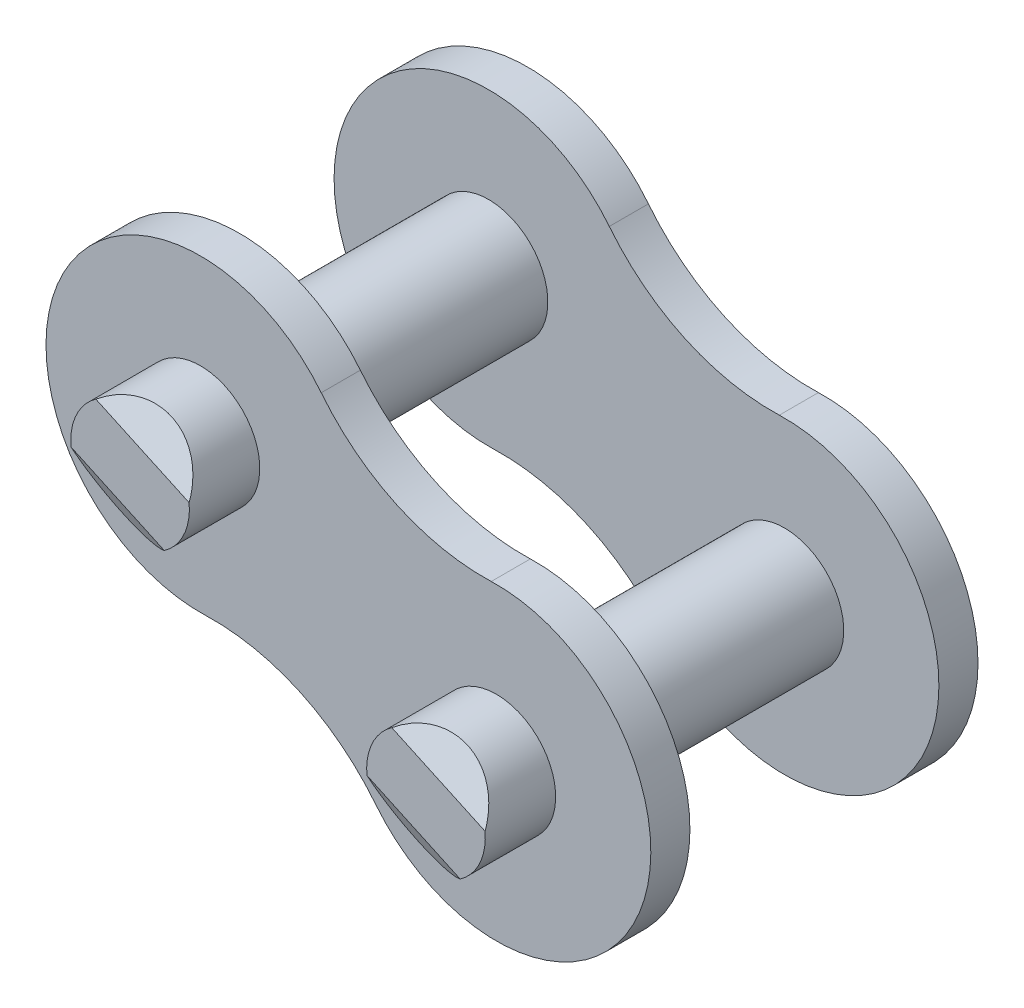
ISO-10303-21;
HEADER;
FILE_DESCRIPTION(('STEP AP214'),'2;1');
FILE_NAME('part.step','',(''),(''),'','','');
FILE_SCHEMA(('AUTOMOTIVE_DESIGN { 1 0 10303 214 1 1 1 1 }'));
ENDSEC;
DATA;
#1=APPLICATION_CONTEXT('core data for automotive mechanical design processes');
#2=APPLICATION_PROTOCOL_DEFINITION('international standard','automotive_design',2000,#1);
#3=PRODUCT_CONTEXT('',#1,'mechanical');
#4=PRODUCT('Part','Part','',(#3));
#5=PRODUCT_RELATED_PRODUCT_CATEGORY('part','',(#4));
#6=PRODUCT_DEFINITION_FORMATION('','',#4);
#7=PRODUCT_DEFINITION_CONTEXT('part definition',#1,'design');
#8=PRODUCT_DEFINITION('design','',#6,#7);
#9=PRODUCT_DEFINITION_SHAPE('','',#8);
#10=(LENGTH_UNIT() NAMED_UNIT(*) SI_UNIT(.MILLI.,.METRE.));
#11=(NAMED_UNIT(*) PLANE_ANGLE_UNIT() SI_UNIT($,.RADIAN.));
#12=(NAMED_UNIT(*) SI_UNIT($,.STERADIAN.) SOLID_ANGLE_UNIT());
#13=UNCERTAINTY_MEASURE_WITH_UNIT(LENGTH_MEASURE(1.E-05),#10,'distance_accuracy_value','');
#14=(GEOMETRIC_REPRESENTATION_CONTEXT(3) GLOBAL_UNCERTAINTY_ASSIGNED_CONTEXT((#13)) GLOBAL_UNIT_ASSIGNED_CONTEXT((#10,
#11,#12)) REPRESENTATION_CONTEXT('',''));
#15=CARTESIAN_POINT('',(0.,0.,0.));
#16=DIRECTION('',(0.,0.,1.));
#17=DIRECTION('',(1.,0.,0.));
#18=AXIS2_PLACEMENT_3D('',#15,#16,#17);
#19=CARTESIAN_POINT('',(102.7187869314,932.554559804421,-131.392489073474));
#20=DIRECTION('',(-0.209479230616201,-0.454002700366908,0.866025403784439));
#21=DIRECTION('',(-0.908005400733816,0.418958461232402,0.));
#22=AXIS2_PLACEMENT_3D('',#19,#20,#21);
#23=PLANE('',#22);
#24=CARTESIAN_POINT('',(115.524136772828,925.691511787227,-131.892921853051));
#25=DIRECTION('',(0.209479230616201,0.454002700366908,-0.866025403784439));
#26=DIRECTION('',(0.362828670557698,0.786355743808955,0.5));
#27=AXIS2_PLACEMENT_3D('',#24,#25,#26);
#28=ELLIPSE('',#27,1.3344874122049,1.1557);
#29=CARTESIAN_POINT('',(114.857440586531,926.635523802605,-131.5593));
#30=VERTEX_POINT('',#29);
#31=CARTESIAN_POINT('',(116.675023252771,925.796881613478,-131.5593));
#32=VERTEX_POINT('',#31);
#33=EDGE_CURVE('E260',#30,#32,#28,.T.);
#34=ORIENTED_EDGE('',*,*,#33,.T.);
#35=DIRECTION('',(0.908005400733817,-0.418958461232401,0.));
#36=VECTOR('',#35,1.);
#37=CARTESIAN_POINT('',(102.597739357989,932.292214344014,-131.5593));
#38=LINE('',#37,#36);
#39=EDGE_CURVE('E353',#30,#32,#38,.T.);
#40=ORIENTED_EDGE('',*,*,#39,.F.);
#41=EDGE_LOOP('',(#34,#40));
#42=FACE_BOUND('',#41,.T.);
#43=ADVANCED_FACE('F17',(#42),#23,.F.);
#44=CARTESIAN_POINT('',(101.992501490931,930.980487041978,-131.392489073474));
#45=DIRECTION('',(-0.209479230616201,-0.454002700366909,-0.866025403784438));
#46=DIRECTION('',(0.,-0.885675807339342,0.464304172169284));
#47=AXIS2_PLACEMENT_3D('',#44,#45,#46);
#48=PLANE('',#47);
#49=CARTESIAN_POINT('',(115.524136772828,925.691511787227,-131.892921853051));
#50=DIRECTION('',(0.209479230616201,0.454002700366908,0.866025403784439));
#51=DIRECTION('',(-0.362828670557697,-0.786355743808954,0.5));
#52=AXIS2_PLACEMENT_3D('',#49,#50,#51);
#53=ELLIPSE('',#52,1.3344874122049,1.1557);
#54=CARTESIAN_POINT('',(114.373250292884,925.586141960977,-131.5593));
#55=VERTEX_POINT('',#54);
#56=CARTESIAN_POINT('',(116.190832959124,924.74749977185,-131.5593));
#57=VERTEX_POINT('',#56);
#58=EDGE_CURVE('E259',#55,#57,#53,.T.);
#59=ORIENTED_EDGE('',*,*,#58,.F.);
#60=DIRECTION('',(0.908005400733817,-0.418958461232401,0.));
#61=VECTOR('',#60,1.);
#62=CARTESIAN_POINT('',(102.113549064342,931.242832502385,-131.5593));
#63=LINE('',#62,#61);
#64=EDGE_CURVE('E356',#55,#57,#63,.T.);
#65=ORIENTED_EDGE('',*,*,#64,.T.);
#66=EDGE_LOOP('',(#59,#65));
#67=FACE_BOUND('',#66,.T.);
#68=ADVANCED_FACE('F431',(#67),#48,.T.);
#69=CARTESIAN_POINT('',(102.7187869314,932.554559804421,-131.392489073474));
#70=DIRECTION('',(-0.209479230616201,-0.454002700366908,0.866025403784439));
#71=DIRECTION('',(-0.908005400733816,0.418958461232402,0.));
#72=AXIS2_PLACEMENT_3D('',#69,#70,#71);
#73=PLANE('',#72);
#74=CARTESIAN_POINT('',(121.289971067487,923.031125558402,-131.892921853051));
#75=DIRECTION('',(0.209479230616201,0.454002700366908,-0.866025403784439));
#76=DIRECTION('',(0.362828670557698,0.786355743808955,0.5));
#77=AXIS2_PLACEMENT_3D('',#74,#75,#76);
#78=ELLIPSE('',#77,1.3344874122049,1.1557);
#79=CARTESIAN_POINT('',(120.62327488119,923.975137573779,-131.5593));
#80=VERTEX_POINT('',#79);
#81=CARTESIAN_POINT('',(122.44085754743,923.136495384652,-131.5593));
#82=VERTEX_POINT('',#81);
#83=EDGE_CURVE('E364',#80,#82,#78,.T.);
#84=ORIENTED_EDGE('',*,*,#83,.T.);
#85=DIRECTION('',(0.908005400733817,-0.418958461232401,0.));
#86=VECTOR('',#85,1.);
#87=CARTESIAN_POINT('',(102.597739357989,932.292214344014,-131.5593));
#88=LINE('',#87,#86);
#89=EDGE_CURVE('E236',#80,#82,#88,.T.);
#90=ORIENTED_EDGE('',*,*,#89,.F.);
#91=EDGE_LOOP('',(#84,#90));
#92=FACE_BOUND('',#91,.T.);
#93=ADVANCED_FACE('F425',(#92),#73,.F.);
#94=CARTESIAN_POINT('',(101.992501490931,930.980487041978,-131.392489073474));
#95=DIRECTION('',(-0.209479230616201,-0.454002700366909,-0.866025403784438));
#96=DIRECTION('',(0.,-0.885675807339342,0.464304172169284));
#97=AXIS2_PLACEMENT_3D('',#94,#95,#96);
#98=PLANE('',#97);
#99=CARTESIAN_POINT('',(121.289971067487,923.031125558402,-131.892921853051));
#100=DIRECTION('',(0.209479230616201,0.454002700366908,0.866025403784439));
#101=DIRECTION('',(-0.362828670557697,-0.786355743808954,0.5));
#102=AXIS2_PLACEMENT_3D('',#99,#100,#101);
#103=ELLIPSE('',#102,1.3344874122049,1.1557);
#104=CARTESIAN_POINT('',(120.139084587544,922.925755732151,-131.5593));
#105=VERTEX_POINT('',#104);
#106=CARTESIAN_POINT('',(121.956667253784,922.087113543024,-131.5593));
#107=VERTEX_POINT('',#106);
#108=EDGE_CURVE('E237',#105,#107,#103,.T.);
#109=ORIENTED_EDGE('',*,*,#108,.F.);
#110=DIRECTION('',(0.908005400733817,-0.418958461232401,0.));
#111=VECTOR('',#110,1.);
#112=CARTESIAN_POINT('',(102.113549064342,931.242832502385,-131.5593));
#113=LINE('',#112,#111);
#114=EDGE_CURVE('E297',#105,#107,#113,.T.);
#115=ORIENTED_EDGE('',*,*,#114,.T.);
#116=EDGE_LOOP('',(#109,#115));
#117=FACE_BOUND('',#116,.T.);
#118=ADVANCED_FACE('F430',(#117),#98,.T.);
#119=CARTESIAN_POINT('',(118.407053920157,924.361318672814,-129.4257));
#120=DIRECTION('',(0.,0.,-1.));
#121=DIRECTION('',(0.,-1.,0.));
#122=AXIS2_PLACEMENT_3D('',#119,#120,#121);
#123=PLANE('',#122);
#124=CARTESIAN_POINT('',(115.524136772828,925.691511787227,-129.4257));
#125=DIRECTION('',(0.,0.,1.));
#126=DIRECTION('',(0.908005400733817,-0.418958461232401,0.));
#127=AXIS2_PLACEMENT_3D('',#124,#125,#126);
#128=CIRCLE('',#127,1.1557);
#129=CARTESIAN_POINT('',(116.573518614456,925.207321493581,-129.4257));
#130=VERTEX_POINT('',#129);
#131=EDGE_CURVE('E288',#130,#130,#128,.T.);
#132=ORIENTED_EDGE('',*,*,#131,.F.);
#133=EDGE_LOOP('',(#132));
#134=FACE_BOUND('',#133,.T.);
#135=CARTESIAN_POINT('',(121.289971067487,923.031125558402,-129.4257));
#136=DIRECTION('',(0.,0.,1.));
#137=DIRECTION('',(0.908005400733817,-0.418958461232401,0.));
#138=AXIS2_PLACEMENT_3D('',#135,#136,#137);
#139=CIRCLE('',#138,1.1557);
#140=CARTESIAN_POINT('',(122.339352909115,922.546935264756,-129.4257));
#141=VERTEX_POINT('',#140);
#142=EDGE_CURVE('E292',#141,#141,#139,.T.);
#143=ORIENTED_EDGE('',*,*,#142,.F.);
#144=EDGE_LOOP('',(#143));
#145=FACE_BOUND('',#144,.T.);
#146=CARTESIAN_POINT('',(115.758367216846,918.620840668423,-129.4257));
#147=DIRECTION('',(0.,0.,1.));
#148=DIRECTION('',(0.908005400733817,-0.418958461232401,0.));
#149=AXIS2_PLACEMENT_3D('',#146,#147,#148);
#150=CIRCLE('',#149,4.06464973628698);
#151=CARTESIAN_POINT('',(118.936524551359,921.154749395229,-129.4257));
#152=VERTEX_POINT('',#151);
#153=CARTESIAN_POINT('',(115.623791201693,922.683261963026,-129.4257));
#154=VERTEX_POINT('',#153);
#155=EDGE_CURVE('E300',#152,#154,#150,.T.);
#156=ORIENTED_EDGE('',*,*,#155,.F.);
#157=CARTESIAN_POINT('',(121.289971067487,923.031125558402,-129.4257));
#158=DIRECTION('',(0.,0.,1.));
#159=DIRECTION('',(0.908005400733817,-0.418958461232401,0.));
#160=AXIS2_PLACEMENT_3D('',#157,#158,#159);
#161=CIRCLE('',#160,3.0099);
#162=CARTESIAN_POINT('',(121.190316638621,926.039375382603,-129.4257));
#163=VERTEX_POINT('',#162);
#164=EDGE_CURVE('E340',#152,#163,#161,.T.);
#165=ORIENTED_EDGE('',*,*,#164,.T.);
#166=CARTESIAN_POINT('',(121.055740623468,930.101796677206,-129.4257));
#167=DIRECTION('',(0.,0.,1.));
#168=DIRECTION('',(0.908005400733817,-0.418958461232401,0.));
#169=AXIS2_PLACEMENT_3D('',#166,#167,#168);
#170=CIRCLE('',#169,4.06464973628691);
#171=CARTESIAN_POINT('',(117.877583288956,927.5678879504,-129.4257));
#172=VERTEX_POINT('',#171);
#173=EDGE_CURVE('E246',#172,#163,#170,.T.);
#174=ORIENTED_EDGE('',*,*,#173,.F.);
#175=CARTESIAN_POINT('',(115.524136772828,925.691511787227,-129.4257));
#176=DIRECTION('',(0.,0.,1.));
#177=DIRECTION('',(0.908005400733817,-0.418958461232401,0.));
#178=AXIS2_PLACEMENT_3D('',#175,#176,#177);
#179=CIRCLE('',#178,3.0099);
#180=EDGE_CURVE('E20',#172,#154,#179,.T.);
#181=ORIENTED_EDGE('',*,*,#180,.T.);
#182=EDGE_LOOP('',(#156,#165,#174,#181));
#183=FACE_BOUND('',#182,.T.);
#184=ADVANCED_FACE('F411',(#134,#145,#183),#123,.F.);
#185=CARTESIAN_POINT('',(118.407053920157,924.361318672814,-130.1877));
#186=DIRECTION('',(0.,0.,-1.));
#187=DIRECTION('',(0.,-1.,0.));
#188=AXIS2_PLACEMENT_3D('',#185,#186,#187);
#189=PLANE('',#188);
#190=CARTESIAN_POINT('',(115.524136772828,925.691511787227,-130.1877));
#191=DIRECTION('',(0.,0.,1.));
#192=DIRECTION('',(0.908005400733817,-0.418958461232401,0.));
#193=AXIS2_PLACEMENT_3D('',#190,#191,#192);
#194=CIRCLE('',#193,1.1557);
#195=CARTESIAN_POINT('',(116.573518614456,925.207321493581,-130.1877));
#196=VERTEX_POINT('',#195);
#197=EDGE_CURVE('E291',#196,#196,#194,.T.);
#198=ORIENTED_EDGE('',*,*,#197,.T.);
#199=EDGE_LOOP('',(#198));
#200=FACE_BOUND('',#199,.T.);
#201=CARTESIAN_POINT('',(121.289971067487,923.031125558402,-130.1877));
#202=DIRECTION('',(0.,0.,1.));
#203=DIRECTION('',(0.908005400733817,-0.418958461232401,0.));
#204=AXIS2_PLACEMENT_3D('',#201,#202,#203);
#205=CIRCLE('',#204,1.1557);
#206=CARTESIAN_POINT('',(122.339352909115,922.546935264756,-130.1877));
#207=VERTEX_POINT('',#206);
#208=EDGE_CURVE('E359',#207,#207,#205,.T.);
#209=ORIENTED_EDGE('',*,*,#208,.T.);
#210=EDGE_LOOP('',(#209));
#211=FACE_BOUND('',#210,.T.);
#212=CARTESIAN_POINT('',(115.758367216846,918.620840668423,-130.1877));
#213=DIRECTION('',(0.,0.,1.));
#214=DIRECTION('',(0.908005400733817,-0.418958461232401,0.));
#215=AXIS2_PLACEMENT_3D('',#212,#213,#214);
#216=CIRCLE('',#215,4.06464973628698);
#217=CARTESIAN_POINT('',(118.936524551359,921.154749395229,-130.1877));
#218=VERTEX_POINT('',#217);
#219=CARTESIAN_POINT('',(115.623791201693,922.683261963026,-130.1877));
#220=VERTEX_POINT('',#219);
#221=EDGE_CURVE('E374',#218,#220,#216,.T.);
#222=ORIENTED_EDGE('',*,*,#221,.T.);
#223=CARTESIAN_POINT('',(115.524136772828,925.691511787227,-130.1877));
#224=DIRECTION('',(0.,0.,1.));
#225=DIRECTION('',(0.908005400733817,-0.418958461232401,0.));
#226=AXIS2_PLACEMENT_3D('',#223,#224,#225);
#227=CIRCLE('',#226,3.0099);
#228=CARTESIAN_POINT('',(117.877583288956,927.5678879504,-130.1877));
#229=VERTEX_POINT('',#228);
#230=EDGE_CURVE('E11',#229,#220,#227,.T.);
#231=ORIENTED_EDGE('',*,*,#230,.F.);
#232=CARTESIAN_POINT('',(121.055740623468,930.101796677206,-130.1877));
#233=DIRECTION('',(0.,0.,1.));
#234=DIRECTION('',(0.908005400733817,-0.418958461232401,0.));
#235=AXIS2_PLACEMENT_3D('',#232,#233,#234);
#236=CIRCLE('',#235,4.06464973628691);
#237=CARTESIAN_POINT('',(121.190316638621,926.039375382603,-130.1877));
#238=VERTEX_POINT('',#237);
#239=EDGE_CURVE('E384',#229,#238,#236,.T.);
#240=ORIENTED_EDGE('',*,*,#239,.T.);
#241=CARTESIAN_POINT('',(121.289971067487,923.031125558402,-130.1877));
#242=DIRECTION('',(0.,0.,1.));
#243=DIRECTION('',(0.908005400733817,-0.418958461232401,0.));
#244=AXIS2_PLACEMENT_3D('',#241,#242,#243);
#245=CIRCLE('',#244,3.0099);
#246=EDGE_CURVE('E247',#218,#238,#245,.T.);
#247=ORIENTED_EDGE('',*,*,#246,.F.);
#248=EDGE_LOOP('',(#222,#231,#240,#247));
#249=FACE_BOUND('',#248,.T.);
#250=ADVANCED_FACE('F394',(#200,#211,#249),#189,.T.);
#251=CARTESIAN_POINT('',(115.524136772828,925.691511787227,-130.1877));
#252=DIRECTION('',(0.,0.,1.));
#253=DIRECTION('',(-0.908005400733817,0.418958461232401,0.));
#254=AXIS2_PLACEMENT_3D('',#251,#252,#253);
#255=CYLINDRICAL_SURFACE('',#254,3.0099);
#256=ORIENTED_EDGE('',*,*,#180,.F.);
#257=DIRECTION('',(0.,0.,1.));
#258=VECTOR('',#257,1.);
#259=CARTESIAN_POINT('',(117.877583288956,927.5678879504,-130.1877));
#260=LINE('',#259,#258);
#261=EDGE_CURVE('E381',#229,#172,#260,.T.);
#262=ORIENTED_EDGE('',*,*,#261,.F.);
#263=ORIENTED_EDGE('',*,*,#230,.T.);
#264=DIRECTION('',(0.,0.,1.));
#265=VECTOR('',#264,1.);
#266=CARTESIAN_POINT('',(115.623791201693,922.683261963026,-130.1877));
#267=LINE('',#266,#265);
#268=EDGE_CURVE('E212',#220,#154,#267,.T.);
#269=ORIENTED_EDGE('',*,*,#268,.T.);
#270=EDGE_LOOP('',(#256,#262,#263,#269));
#271=FACE_BOUND('',#270,.T.);
#272=ADVANCED_FACE('F409',(#271),#255,.T.);
#273=CARTESIAN_POINT('',(121.055740623468,930.101796677206,-130.1877));
#274=DIRECTION('',(0.,0.,1.));
#275=DIRECTION('',(-0.908005400733817,0.418958461232401,0.));
#276=AXIS2_PLACEMENT_3D('',#273,#274,#275);
#277=CYLINDRICAL_SURFACE('',#276,4.06464973628691);
#278=ORIENTED_EDGE('',*,*,#173,.T.);
#279=DIRECTION('',(0.,0.,1.));
#280=VECTOR('',#279,1.);
#281=CARTESIAN_POINT('',(121.190316638621,926.039375382603,-130.1877));
#282=LINE('',#281,#280);
#283=EDGE_CURVE('E242',#238,#163,#282,.T.);
#284=ORIENTED_EDGE('',*,*,#283,.F.);
#285=ORIENTED_EDGE('',*,*,#239,.F.);
#286=ORIENTED_EDGE('',*,*,#261,.T.);
#287=EDGE_LOOP('',(#278,#284,#285,#286));
#288=FACE_BOUND('',#287,.T.);
#289=ADVANCED_FACE('F397',(#288),#277,.F.);
#290=CARTESIAN_POINT('',(121.289971067487,923.031125558402,-130.1877));
#291=DIRECTION('',(0.,0.,1.));
#292=DIRECTION('',(-0.908005400733817,0.418958461232401,0.));
#293=AXIS2_PLACEMENT_3D('',#290,#291,#292);
#294=CYLINDRICAL_SURFACE('',#293,3.0099);
#295=ORIENTED_EDGE('',*,*,#164,.F.);
#296=DIRECTION('',(0.,0.,1.));
#297=VECTOR('',#296,1.);
#298=CARTESIAN_POINT('',(118.936524551359,921.154749395229,-130.1877));
#299=LINE('',#298,#297);
#300=EDGE_CURVE('E377',#218,#152,#299,.T.);
#301=ORIENTED_EDGE('',*,*,#300,.F.);
#302=ORIENTED_EDGE('',*,*,#246,.T.);
#303=ORIENTED_EDGE('',*,*,#283,.T.);
#304=EDGE_LOOP('',(#295,#301,#302,#303));
#305=FACE_BOUND('',#304,.T.);
#306=ADVANCED_FACE('F400',(#305),#294,.T.);
#307=CARTESIAN_POINT('',(115.758367216846,918.620840668423,-130.1877));
#308=DIRECTION('',(0.,0.,1.));
#309=DIRECTION('',(-0.908005400733817,0.418958461232401,0.));
#310=AXIS2_PLACEMENT_3D('',#307,#308,#309);
#311=CYLINDRICAL_SURFACE('',#310,4.06464973628698);
#312=ORIENTED_EDGE('',*,*,#155,.T.);
#313=ORIENTED_EDGE('',*,*,#268,.F.);
#314=ORIENTED_EDGE('',*,*,#221,.F.);
#315=ORIENTED_EDGE('',*,*,#300,.T.);
#316=EDGE_LOOP('',(#312,#313,#314,#315));
#317=FACE_BOUND('',#316,.T.);
#318=ADVANCED_FACE('F405',(#317),#311,.F.);
#319=CARTESIAN_POINT('',(118.407053920157,924.361318672814,-131.5593));
#320=DIRECTION('',(0.,0.,-1.));
#321=DIRECTION('',(0.,-1.,0.));
#322=AXIS2_PLACEMENT_3D('',#319,#320,#321);
#323=PLANE('',#322);
#324=ORIENTED_EDGE('',*,*,#89,.T.);
#325=CARTESIAN_POINT('',(121.289971067487,923.031125558402,-131.5593));
#326=DIRECTION('',(0.,0.,1.));
#327=DIRECTION('',(0.908005400733817,-0.418958461232401,0.));
#328=AXIS2_PLACEMENT_3D('',#325,#326,#327);
#329=CIRCLE('',#328,1.1557);
#330=EDGE_CURVE('E232',#107,#82,#329,.T.);
#331=ORIENTED_EDGE('',*,*,#330,.F.);
#332=ORIENTED_EDGE('',*,*,#114,.F.);
#333=CARTESIAN_POINT('',(121.289971067487,923.031125558402,-131.5593));
#334=DIRECTION('',(0.,0.,1.));
#335=DIRECTION('',(0.908005400733817,-0.418958461232401,0.));
#336=AXIS2_PLACEMENT_3D('',#333,#334,#335);
#337=CIRCLE('',#336,1.1557);
#338=EDGE_CURVE('E304',#80,#105,#337,.T.);
#339=ORIENTED_EDGE('',*,*,#338,.F.);
#340=EDGE_LOOP('',(#324,#331,#332,#339));
#341=FACE_BOUND('',#340,.T.);
#342=ADVANCED_FACE('F486',(#341),#323,.T.);
#343=CARTESIAN_POINT('',(121.289971067487,923.031125558402,-131.5593));
#344=DIRECTION('',(0.,0.,1.));
#345=DIRECTION('',(-0.908005400733817,0.418958461232401,0.));
#346=AXIS2_PLACEMENT_3D('',#343,#344,#345);
#347=CYLINDRICAL_SURFACE('',#346,1.1557);
#348=ORIENTED_EDGE('',*,*,#83,.F.);
#349=ORIENTED_EDGE('',*,*,#338,.T.);
#350=ORIENTED_EDGE('',*,*,#108,.T.);
#351=ORIENTED_EDGE('',*,*,#330,.T.);
#352=EDGE_LOOP('',(#348,#349,#350,#351));
#353=FACE_BOUND('',#352,.T.);
#354=ORIENTED_EDGE('',*,*,#208,.F.);
#355=EDGE_LOOP('',(#354));
#356=FACE_BOUND('',#355,.T.);
#357=ADVANCED_FACE('F601',(#353,#356),#347,.T.);
#358=CARTESIAN_POINT('',(118.407053920157,924.361318672814,-131.5593));
#359=DIRECTION('',(0.,0.,-1.));
#360=DIRECTION('',(0.,-1.,0.));
#361=AXIS2_PLACEMENT_3D('',#358,#359,#360);
#362=PLANE('',#361);
#363=ORIENTED_EDGE('',*,*,#39,.T.);
#364=CARTESIAN_POINT('',(115.524136772828,925.691511787227,-131.5593));
#365=DIRECTION('',(0.,0.,1.));
#366=DIRECTION('',(0.908005400733817,-0.418958461232401,0.));
#367=AXIS2_PLACEMENT_3D('',#364,#365,#366);
#368=CIRCLE('',#367,1.1557);
#369=EDGE_CURVE('E349',#57,#32,#368,.T.);
#370=ORIENTED_EDGE('',*,*,#369,.F.);
#371=ORIENTED_EDGE('',*,*,#64,.F.);
#372=CARTESIAN_POINT('',(115.524136772828,925.691511787227,-131.5593));
#373=DIRECTION('',(0.,0.,1.));
#374=DIRECTION('',(0.908005400733817,-0.418958461232401,0.));
#375=AXIS2_PLACEMENT_3D('',#372,#373,#374);
#376=CIRCLE('',#375,1.1557);
#377=EDGE_CURVE('E255',#30,#55,#376,.T.);
#378=ORIENTED_EDGE('',*,*,#377,.F.);
#379=EDGE_LOOP('',(#363,#370,#371,#378));
#380=FACE_BOUND('',#379,.T.);
#381=ADVANCED_FACE('F592',(#380),#362,.T.);
#382=CARTESIAN_POINT('',(115.524136772828,925.691511787227,-131.5593));
#383=DIRECTION('',(0.,0.,1.));
#384=DIRECTION('',(-0.908005400733817,0.418958461232401,0.));
#385=AXIS2_PLACEMENT_3D('',#382,#383,#384);
#386=CYLINDRICAL_SURFACE('',#385,1.1557);
#387=ORIENTED_EDGE('',*,*,#33,.F.);
#388=ORIENTED_EDGE('',*,*,#377,.T.);
#389=ORIENTED_EDGE('',*,*,#58,.T.);
#390=ORIENTED_EDGE('',*,*,#369,.T.);
#391=EDGE_LOOP('',(#387,#388,#389,#390));
#392=FACE_BOUND('',#391,.T.);
#393=ORIENTED_EDGE('',*,*,#197,.F.);
#394=EDGE_LOOP('',(#393));
#395=FACE_BOUND('',#394,.T.);
#396=ADVANCED_FACE('F444',(#392,#395),#386,.T.);
#397=CARTESIAN_POINT('',(102.7187869314,932.554559804421,-122.607510926526));
#398=DIRECTION('',(-0.209479230616201,-0.454002700366908,-0.866025403784439));
#399=DIRECTION('',(0.,-0.885675807339343,0.464304172169283));
#400=AXIS2_PLACEMENT_3D('',#397,#398,#399);
#401=PLANE('',#400);
#402=CARTESIAN_POINT('',(115.524136772828,925.691511787227,-122.107078146949));
#403=DIRECTION('',(-0.209479230616201,-0.454002700366908,-0.866025403784439));
#404=DIRECTION('',(0.362828670557698,0.786355743808955,-0.5));
#405=AXIS2_PLACEMENT_3D('',#402,#403,#404);
#406=ELLIPSE('',#405,1.3344874122049,1.1557);
#407=CARTESIAN_POINT('',(114.857440586531,926.635523802605,-122.4407));
#408=VERTEX_POINT('',#407);
#409=CARTESIAN_POINT('',(116.675023252771,925.796881613478,-122.4407));
#410=VERTEX_POINT('',#409);
#411=EDGE_CURVE('E201',#408,#410,#406,.T.);
#412=ORIENTED_EDGE('',*,*,#411,.F.);
#413=DIRECTION('',(0.908005400733817,-0.418958461232401,0.));
#414=VECTOR('',#413,1.);
#415=CARTESIAN_POINT('',(102.597739357989,932.292214344014,-122.4407));
#416=LINE('',#415,#414);
#417=EDGE_CURVE('E241',#408,#410,#416,.T.);
#418=ORIENTED_EDGE('',*,*,#417,.T.);
#419=EDGE_LOOP('',(#412,#418));
#420=FACE_BOUND('',#419,.T.);
#421=ADVANCED_FACE('F438',(#420),#401,.F.);
#422=CARTESIAN_POINT('',(101.992501490931,930.980487041978,-122.607510926526));
#423=DIRECTION('',(-0.209479230616201,-0.454002700366909,0.866025403784438));
#424=DIRECTION('',(-0.908005400733816,0.418958461232401,0.));
#425=AXIS2_PLACEMENT_3D('',#422,#423,#424);
#426=PLANE('',#425);
#427=CARTESIAN_POINT('',(115.524136772828,925.691511787227,-122.107078146949));
#428=DIRECTION('',(-0.209479230616201,-0.454002700366908,0.866025403784439));
#429=DIRECTION('',(-0.362828670557697,-0.786355743808954,-0.5));
#430=AXIS2_PLACEMENT_3D('',#427,#428,#429);
#431=ELLIPSE('',#430,1.3344874122049,1.1557);
#432=CARTESIAN_POINT('',(114.373250292884,925.586141960977,-122.4407));
#433=VERTEX_POINT('',#432);
#434=CARTESIAN_POINT('',(116.190832959124,924.74749977185,-122.4407));
#435=VERTEX_POINT('',#434);
#436=EDGE_CURVE('E227',#433,#435,#431,.T.);
#437=ORIENTED_EDGE('',*,*,#436,.T.);
#438=DIRECTION('',(0.908005400733817,-0.418958461232401,0.));
#439=VECTOR('',#438,1.);
#440=CARTESIAN_POINT('',(102.113549064342,931.242832502385,-122.4407));
#441=LINE('',#440,#439);
#442=EDGE_CURVE('E250',#433,#435,#441,.T.);
#443=ORIENTED_EDGE('',*,*,#442,.F.);
#444=EDGE_LOOP('',(#437,#443));
#445=FACE_BOUND('',#444,.T.);
#446=ADVANCED_FACE('F443',(#445),#426,.T.);
#447=CARTESIAN_POINT('',(102.7187869314,932.554559804421,-122.607510926526));
#448=DIRECTION('',(-0.209479230616201,-0.454002700366908,-0.866025403784439));
#449=DIRECTION('',(0.,-0.885675807339343,0.464304172169283));
#450=AXIS2_PLACEMENT_3D('',#447,#448,#449);
#451=PLANE('',#450);
#452=CARTESIAN_POINT('',(121.289971067487,923.031125558402,-122.107078146949));
#453=DIRECTION('',(-0.209479230616201,-0.454002700366908,-0.866025403784439));
#454=DIRECTION('',(0.362828670557698,0.786355743808955,-0.5));
#455=AXIS2_PLACEMENT_3D('',#452,#453,#454);
#456=ELLIPSE('',#455,1.3344874122049,1.1557);
#457=CARTESIAN_POINT('',(120.62327488119,923.975137573779,-122.4407));
#458=VERTEX_POINT('',#457);
#459=CARTESIAN_POINT('',(122.44085754743,923.136495384652,-122.4407));
#460=VERTEX_POINT('',#459);
#461=EDGE_CURVE('E254',#458,#460,#456,.T.);
#462=ORIENTED_EDGE('',*,*,#461,.F.);
#463=DIRECTION('',(0.908005400733817,-0.418958461232401,0.));
#464=VECTOR('',#463,1.);
#465=CARTESIAN_POINT('',(102.597739357989,932.292214344014,-122.4407));
#466=LINE('',#465,#464);
#467=EDGE_CURVE('E216',#458,#460,#466,.T.);
#468=ORIENTED_EDGE('',*,*,#467,.T.);
#469=EDGE_LOOP('',(#462,#468));
#470=FACE_BOUND('',#469,.T.);
#471=ADVANCED_FACE('F524',(#470),#451,.F.);
#472=CARTESIAN_POINT('',(101.992501490931,930.980487041978,-122.607510926526));
#473=DIRECTION('',(-0.209479230616201,-0.454002700366909,0.866025403784438));
#474=DIRECTION('',(-0.908005400733816,0.418958461232401,0.));
#475=AXIS2_PLACEMENT_3D('',#472,#473,#474);
#476=PLANE('',#475);
#477=CARTESIAN_POINT('',(121.289971067487,923.031125558402,-122.107078146949));
#478=DIRECTION('',(-0.209479230616201,-0.454002700366908,0.866025403784439));
#479=DIRECTION('',(-0.362828670557697,-0.786355743808954,-0.5));
#480=AXIS2_PLACEMENT_3D('',#477,#478,#479);
#481=ELLIPSE('',#480,1.3344874122049,1.1557);
#482=CARTESIAN_POINT('',(120.139084587544,922.925755732151,-122.4407));
#483=VERTEX_POINT('',#482);
#484=CARTESIAN_POINT('',(121.956667253784,922.087113543024,-122.4407));
#485=VERTEX_POINT('',#484);
#486=EDGE_CURVE('E217',#483,#485,#481,.T.);
#487=ORIENTED_EDGE('',*,*,#486,.T.);
#488=DIRECTION('',(0.908005400733817,-0.418958461232401,0.));
#489=VECTOR('',#488,1.);
#490=CARTESIAN_POINT('',(102.113549064342,931.242832502385,-122.4407));
#491=LINE('',#490,#489);
#492=EDGE_CURVE('E275',#483,#485,#491,.T.);
#493=ORIENTED_EDGE('',*,*,#492,.F.);
#494=EDGE_LOOP('',(#487,#493));
#495=FACE_BOUND('',#494,.T.);
#496=ADVANCED_FACE('F466',(#495),#476,.T.);
#497=CARTESIAN_POINT('',(115.524136772828,925.691511787227,-122.4407));
#498=DIRECTION('',(0.,0.,-1.));
#499=DIRECTION('',(-0.908005400733817,0.418958461232401,0.));
#500=AXIS2_PLACEMENT_3D('',#497,#498,#499);
#501=CYLINDRICAL_SURFACE('',#500,1.1557);
#502=ORIENTED_EDGE('',*,*,#131,.T.);
#503=EDGE_LOOP('',(#502));
#504=FACE_BOUND('',#503,.T.);
#505=CARTESIAN_POINT('',(115.524136772828,925.691511787227,-124.5743));
#506=DIRECTION('',(0.,0.,1.));
#507=DIRECTION('',(0.908005400733817,-0.418958461232401,0.));
#508=AXIS2_PLACEMENT_3D('',#505,#506,#507);
#509=CIRCLE('',#508,1.1557);
#510=CARTESIAN_POINT('',(116.573518614456,925.207321493581,-124.5743));
#511=VERTEX_POINT('',#510);
#512=EDGE_CURVE('E332',#511,#511,#509,.T.);
#513=ORIENTED_EDGE('',*,*,#512,.F.);
#514=EDGE_LOOP('',(#513));
#515=FACE_BOUND('',#514,.T.);
#516=ADVANCED_FACE('F460',(#504,#515),#501,.T.);
#517=CARTESIAN_POINT('',(121.289971067487,923.031125558402,-122.4407));
#518=DIRECTION('',(0.,0.,-1.));
#519=DIRECTION('',(-0.908005400733817,0.418958461232401,0.));
#520=AXIS2_PLACEMENT_3D('',#517,#518,#519);
#521=CYLINDRICAL_SURFACE('',#520,1.1557);
#522=ORIENTED_EDGE('',*,*,#142,.T.);
#523=EDGE_LOOP('',(#522));
#524=FACE_BOUND('',#523,.T.);
#525=CARTESIAN_POINT('',(121.289971067487,923.031125558402,-124.5743));
#526=DIRECTION('',(0.,0.,1.));
#527=DIRECTION('',(0.908005400733817,-0.418958461232401,0.));
#528=AXIS2_PLACEMENT_3D('',#525,#526,#527);
#529=CIRCLE('',#528,1.1557);
#530=CARTESIAN_POINT('',(122.339352909115,922.546935264756,-124.5743));
#531=VERTEX_POINT('',#530);
#532=EDGE_CURVE('E322',#531,#531,#529,.T.);
#533=ORIENTED_EDGE('',*,*,#532,.F.);
#534=EDGE_LOOP('',(#533));
#535=FACE_BOUND('',#534,.T.);
#536=ADVANCED_FACE('F465',(#524,#535),#521,.T.);
#537=CARTESIAN_POINT('',(118.407053920157,924.361318672814,-124.5743));
#538=DIRECTION('',(0.,0.,1.));
#539=DIRECTION('',(1.,0.,0.));
#540=AXIS2_PLACEMENT_3D('',#537,#538,#539);
#541=PLANE('',#540);
#542=ORIENTED_EDGE('',*,*,#512,.T.);
#543=EDGE_LOOP('',(#542));
#544=FACE_BOUND('',#543,.T.);
#545=ORIENTED_EDGE('',*,*,#532,.T.);
#546=EDGE_LOOP('',(#545));
#547=FACE_BOUND('',#546,.T.);
#548=CARTESIAN_POINT('',(115.758367216846,918.620840668423,-124.5743));
#549=DIRECTION('',(0.,0.,1.));
#550=DIRECTION('',(0.908005400733817,-0.418958461232401,0.));
#551=AXIS2_PLACEMENT_3D('',#548,#549,#550);
#552=CIRCLE('',#551,4.06464973628698);
#553=CARTESIAN_POINT('',(118.936524551359,921.154749395229,-124.5743));
#554=VERTEX_POINT('',#553);
#555=CARTESIAN_POINT('',(115.623791201693,922.683261963026,-124.5743));
#556=VERTEX_POINT('',#555);
#557=EDGE_CURVE('E278',#554,#556,#552,.T.);
#558=ORIENTED_EDGE('',*,*,#557,.T.);
#559=CARTESIAN_POINT('',(115.524136772828,925.691511787227,-124.5743));
#560=DIRECTION('',(0.,0.,1.));
#561=DIRECTION('',(0.908005400733817,-0.418958461232401,0.));
#562=AXIS2_PLACEMENT_3D('',#559,#560,#561);
#563=CIRCLE('',#562,3.0099);
#564=CARTESIAN_POINT('',(117.877583288956,927.5678879504,-124.5743));
#565=VERTEX_POINT('',#564);
#566=EDGE_CURVE('E282',#565,#556,#563,.T.);
#567=ORIENTED_EDGE('',*,*,#566,.F.);
#568=CARTESIAN_POINT('',(121.055740623468,930.101796677206,-124.5743));
#569=DIRECTION('',(0.,0.,1.));
#570=DIRECTION('',(0.908005400733817,-0.418958461232401,0.));
#571=AXIS2_PLACEMENT_3D('',#568,#569,#570);
#572=CIRCLE('',#571,4.06464973628691);
#573=CARTESIAN_POINT('',(121.190316638621,926.039375382603,-124.5743));
#574=VERTEX_POINT('',#573);
#575=EDGE_CURVE('E318',#565,#574,#572,.T.);
#576=ORIENTED_EDGE('',*,*,#575,.T.);
#577=CARTESIAN_POINT('',(121.289971067487,923.031125558402,-124.5743));
#578=DIRECTION('',(0.,0.,1.));
#579=DIRECTION('',(0.908005400733817,-0.418958461232401,0.));
#580=AXIS2_PLACEMENT_3D('',#577,#578,#579);
#581=CIRCLE('',#580,3.0099);
#582=EDGE_CURVE('E222',#554,#574,#581,.T.);
#583=ORIENTED_EDGE('',*,*,#582,.F.);
#584=EDGE_LOOP('',(#558,#567,#576,#583));
#585=FACE_BOUND('',#584,.T.);
#586=ADVANCED_FACE('F476',(#544,#547,#585),#541,.F.);
#587=CARTESIAN_POINT('',(118.407053920157,924.361318672814,-123.8123));
#588=DIRECTION('',(0.,0.,1.));
#589=DIRECTION('',(1.,0.,0.));
#590=AXIS2_PLACEMENT_3D('',#587,#588,#589);
#591=PLANE('',#590);
#592=CARTESIAN_POINT('',(115.524136772828,925.691511787227,-123.8123));
#593=DIRECTION('',(0.,0.,1.));
#594=DIRECTION('',(0.908005400733817,-0.418958461232401,0.));
#595=AXIS2_PLACEMENT_3D('',#592,#593,#594);
#596=CIRCLE('',#595,1.1557);
#597=CARTESIAN_POINT('',(116.573518614456,925.207321493581,-123.8123));
#598=VERTEX_POINT('',#597);
#599=EDGE_CURVE('E197',#598,#598,#596,.T.);
#600=ORIENTED_EDGE('',*,*,#599,.F.);
#601=EDGE_LOOP('',(#600));
#602=FACE_BOUND('',#601,.T.);
#603=CARTESIAN_POINT('',(121.289971067487,923.031125558402,-123.8123));
#604=DIRECTION('',(0.,0.,1.));
#605=DIRECTION('',(0.908005400733817,-0.418958461232401,0.));
#606=AXIS2_PLACEMENT_3D('',#603,#604,#605);
#607=CIRCLE('',#606,1.1557);
#608=CARTESIAN_POINT('',(122.339352909115,922.546935264756,-123.8123));
#609=VERTEX_POINT('',#608);
#610=EDGE_CURVE('E251',#609,#609,#607,.T.);
#611=ORIENTED_EDGE('',*,*,#610,.F.);
#612=EDGE_LOOP('',(#611));
#613=FACE_BOUND('',#612,.T.);
#614=CARTESIAN_POINT('',(115.758367216846,918.620840668423,-123.8123));
#615=DIRECTION('',(0.,0.,1.));
#616=DIRECTION('',(0.908005400733817,-0.418958461232401,0.));
#617=AXIS2_PLACEMENT_3D('',#614,#615,#616);
#618=CIRCLE('',#617,4.06464973628698);
#619=CARTESIAN_POINT('',(118.936524551359,921.154749395229,-123.8123));
#620=VERTEX_POINT('',#619);
#621=CARTESIAN_POINT('',(115.623791201693,922.683261963026,-123.8123));
#622=VERTEX_POINT('',#621);
#623=EDGE_CURVE('E296',#620,#622,#618,.T.);
#624=ORIENTED_EDGE('',*,*,#623,.F.);
#625=CARTESIAN_POINT('',(121.289971067487,923.031125558402,-123.8123));
#626=DIRECTION('',(0.,0.,1.));
#627=DIRECTION('',(0.908005400733817,-0.418958461232401,0.));
#628=AXIS2_PLACEMENT_3D('',#625,#626,#627);
#629=CIRCLE('',#628,3.0099);
#630=CARTESIAN_POINT('',(121.190316638621,926.039375382603,-123.8123));
#631=VERTEX_POINT('',#630);
#632=EDGE_CURVE('E221',#620,#631,#629,.T.);
#633=ORIENTED_EDGE('',*,*,#632,.T.);
#634=CARTESIAN_POINT('',(121.055740623468,930.101796677206,-123.8123));
#635=DIRECTION('',(0.,0.,1.));
#636=DIRECTION('',(0.908005400733817,-0.418958461232401,0.));
#637=AXIS2_PLACEMENT_3D('',#634,#635,#636);
#638=CIRCLE('',#637,4.06464973628691);
#639=CARTESIAN_POINT('',(117.877583288956,927.5678879504,-123.8123));
#640=VERTEX_POINT('',#639);
#641=EDGE_CURVE('E279',#640,#631,#638,.T.);
#642=ORIENTED_EDGE('',*,*,#641,.F.);
#643=CARTESIAN_POINT('',(115.524136772828,925.691511787227,-123.8123));
#644=DIRECTION('',(0.,0.,1.));
#645=DIRECTION('',(0.908005400733817,-0.418958461232401,0.));
#646=AXIS2_PLACEMENT_3D('',#643,#644,#645);
#647=CIRCLE('',#646,3.0099);
#648=EDGE_CURVE('E319',#640,#622,#647,.T.);
#649=ORIENTED_EDGE('',*,*,#648,.T.);
#650=EDGE_LOOP('',(#624,#633,#642,#649));
#651=FACE_BOUND('',#650,.T.);
#652=ADVANCED_FACE('F553',(#602,#613,#651),#591,.T.);
#653=CARTESIAN_POINT('',(115.524136772828,925.691511787227,-123.8123));
#654=DIRECTION('',(0.,0.,-1.));
#655=DIRECTION('',(-0.908005400733817,0.418958461232401,0.));
#656=AXIS2_PLACEMENT_3D('',#653,#654,#655);
#657=CYLINDRICAL_SURFACE('',#656,3.0099);
#658=ORIENTED_EDGE('',*,*,#566,.T.);
#659=DIRECTION('',(0.,0.,-1.));
#660=VECTOR('',#659,1.);
#661=CARTESIAN_POINT('',(115.623791201693,922.683261963026,-123.8123));
#662=LINE('',#661,#660);
#663=EDGE_CURVE('E308',#622,#556,#662,.T.);
#664=ORIENTED_EDGE('',*,*,#663,.F.);
#665=ORIENTED_EDGE('',*,*,#648,.F.);
#666=DIRECTION('',(0.,0.,-1.));
#667=VECTOR('',#666,1.);
#668=CARTESIAN_POINT('',(117.877583288956,927.5678879504,-123.8123));
#669=LINE('',#668,#667);
#670=EDGE_CURVE('E283',#640,#565,#669,.T.);
#671=ORIENTED_EDGE('',*,*,#670,.T.);
#672=EDGE_LOOP('',(#658,#664,#665,#671));
#673=FACE_BOUND('',#672,.T.);
#674=ADVANCED_FACE('F543',(#673),#657,.T.);
#675=CARTESIAN_POINT('',(121.055740623468,930.101796677206,-123.8123));
#676=DIRECTION('',(0.,0.,-1.));
#677=DIRECTION('',(-0.908005400733817,0.418958461232401,0.));
#678=AXIS2_PLACEMENT_3D('',#675,#676,#677);
#679=CYLINDRICAL_SURFACE('',#678,4.06464973628691);
#680=ORIENTED_EDGE('',*,*,#575,.F.);
#681=ORIENTED_EDGE('',*,*,#670,.F.);
#682=ORIENTED_EDGE('',*,*,#641,.T.);
#683=DIRECTION('',(0.,0.,-1.));
#684=VECTOR('',#683,1.);
#685=CARTESIAN_POINT('',(121.190316638621,926.039375382603,-123.8123));
#686=LINE('',#685,#684);
#687=EDGE_CURVE('E218',#631,#574,#686,.T.);
#688=ORIENTED_EDGE('',*,*,#687,.T.);
#689=EDGE_LOOP('',(#680,#681,#682,#688));
#690=FACE_BOUND('',#689,.T.);
#691=ADVANCED_FACE('F533',(#690),#679,.F.);
#692=CARTESIAN_POINT('',(121.289971067487,923.031125558402,-123.8123));
#693=DIRECTION('',(0.,0.,-1.));
#694=DIRECTION('',(-0.908005400733817,0.418958461232401,0.));
#695=AXIS2_PLACEMENT_3D('',#692,#693,#694);
#696=CYLINDRICAL_SURFACE('',#695,3.0099);
#697=ORIENTED_EDGE('',*,*,#582,.T.);
#698=ORIENTED_EDGE('',*,*,#687,.F.);
#699=ORIENTED_EDGE('',*,*,#632,.F.);
#700=DIRECTION('',(0.,0.,-1.));
#701=VECTOR('',#700,1.);
#702=CARTESIAN_POINT('',(118.936524551359,921.154749395229,-123.8123));
#703=LINE('',#702,#701);
#704=EDGE_CURVE('E287',#620,#554,#703,.T.);
#705=ORIENTED_EDGE('',*,*,#704,.T.);
#706=EDGE_LOOP('',(#697,#698,#699,#705));
#707=FACE_BOUND('',#706,.T.);
#708=ADVANCED_FACE('F514',(#707),#696,.T.);
#709=CARTESIAN_POINT('',(115.758367216846,918.620840668423,-123.8123));
#710=DIRECTION('',(0.,0.,-1.));
#711=DIRECTION('',(-0.908005400733817,0.418958461232401,0.));
#712=AXIS2_PLACEMENT_3D('',#709,#710,#711);
#713=CYLINDRICAL_SURFACE('',#712,4.06464973628698);
#714=ORIENTED_EDGE('',*,*,#557,.F.);
#715=ORIENTED_EDGE('',*,*,#704,.F.);
#716=ORIENTED_EDGE('',*,*,#623,.T.);
#717=ORIENTED_EDGE('',*,*,#663,.T.);
#718=EDGE_LOOP('',(#714,#715,#716,#717));
#719=FACE_BOUND('',#718,.T.);
#720=ADVANCED_FACE('F505',(#719),#713,.F.);
#721=CARTESIAN_POINT('',(118.407053920157,924.361318672814,-122.4407));
#722=DIRECTION('',(0.,0.,1.));
#723=DIRECTION('',(1.,0.,0.));
#724=AXIS2_PLACEMENT_3D('',#721,#722,#723);
#725=PLANE('',#724);
#726=ORIENTED_EDGE('',*,*,#467,.F.);
#727=CARTESIAN_POINT('',(121.289971067487,923.031125558402,-122.4407));
#728=DIRECTION('',(0.,0.,1.));
#729=DIRECTION('',(0.908005400733817,-0.418958461232401,0.));
#730=AXIS2_PLACEMENT_3D('',#727,#728,#729);
#731=CIRCLE('',#730,1.1557);
#732=EDGE_CURVE('E213',#458,#483,#731,.T.);
#733=ORIENTED_EDGE('',*,*,#732,.T.);
#734=ORIENTED_EDGE('',*,*,#492,.T.);
#735=CARTESIAN_POINT('',(121.289971067487,923.031125558402,-122.4407));
#736=DIRECTION('',(0.,0.,1.));
#737=DIRECTION('',(0.908005400733817,-0.418958461232401,0.));
#738=AXIS2_PLACEMENT_3D('',#735,#736,#737);
#739=CIRCLE('',#738,1.1557);
#740=EDGE_CURVE('E266',#485,#460,#739,.T.);
#741=ORIENTED_EDGE('',*,*,#740,.T.);
#742=EDGE_LOOP('',(#726,#733,#734,#741));
#743=FACE_BOUND('',#742,.T.);
#744=ADVANCED_FACE('F496',(#743),#725,.T.);
#745=CARTESIAN_POINT('',(121.289971067487,923.031125558402,-122.4407));
#746=DIRECTION('',(0.,0.,-1.));
#747=DIRECTION('',(-0.908005400733817,0.418958461232401,0.));
#748=AXIS2_PLACEMENT_3D('',#745,#746,#747);
#749=CYLINDRICAL_SURFACE('',#748,1.1557);
#750=ORIENTED_EDGE('',*,*,#461,.T.);
#751=ORIENTED_EDGE('',*,*,#740,.F.);
#752=ORIENTED_EDGE('',*,*,#486,.F.);
#753=ORIENTED_EDGE('',*,*,#732,.F.);
#754=EDGE_LOOP('',(#750,#751,#752,#753));
#755=FACE_BOUND('',#754,.T.);
#756=ORIENTED_EDGE('',*,*,#610,.T.);
#757=EDGE_LOOP('',(#756));
#758=FACE_BOUND('',#757,.T.);
#759=ADVANCED_FACE('F454',(#755,#758),#749,.T.);
#760=CARTESIAN_POINT('',(118.407053920157,924.361318672814,-122.4407));
#761=DIRECTION('',(0.,0.,1.));
#762=DIRECTION('',(1.,0.,0.));
#763=AXIS2_PLACEMENT_3D('',#760,#761,#762);
#764=PLANE('',#763);
#765=ORIENTED_EDGE('',*,*,#417,.F.);
#766=CARTESIAN_POINT('',(115.524136772828,925.691511787227,-122.4407));
#767=DIRECTION('',(0.,0.,1.));
#768=DIRECTION('',(0.908005400733817,-0.418958461232401,0.));
#769=AXIS2_PLACEMENT_3D('',#766,#767,#768);
#770=CIRCLE('',#769,1.1557);
#771=EDGE_CURVE('E231',#408,#433,#770,.T.);
#772=ORIENTED_EDGE('',*,*,#771,.T.);
#773=ORIENTED_EDGE('',*,*,#442,.T.);
#774=CARTESIAN_POINT('',(115.524136772828,925.691511787227,-122.4407));
#775=DIRECTION('',(0.,0.,1.));
#776=DIRECTION('',(0.908005400733817,-0.418958461232401,0.));
#777=AXIS2_PLACEMENT_3D('',#774,#775,#776);
#778=CIRCLE('',#777,1.1557);
#779=EDGE_CURVE('E208',#435,#410,#778,.T.);
#780=ORIENTED_EDGE('',*,*,#779,.T.);
#781=EDGE_LOOP('',(#765,#772,#773,#780));
#782=FACE_BOUND('',#781,.T.);
#783=ADVANCED_FACE('F418',(#782),#764,.T.);
#784=CARTESIAN_POINT('',(115.524136772828,925.691511787227,-122.4407));
#785=DIRECTION('',(0.,0.,-1.));
#786=DIRECTION('',(-0.908005400733817,0.418958461232401,0.));
#787=AXIS2_PLACEMENT_3D('',#784,#785,#786);
#788=CYLINDRICAL_SURFACE('',#787,1.1557);
#789=ORIENTED_EDGE('',*,*,#411,.T.);
#790=ORIENTED_EDGE('',*,*,#779,.F.);
#791=ORIENTED_EDGE('',*,*,#436,.F.);
#792=ORIENTED_EDGE('',*,*,#771,.F.);
#793=EDGE_LOOP('',(#789,#790,#791,#792));
#794=FACE_BOUND('',#793,.T.);
#795=ORIENTED_EDGE('',*,*,#599,.T.);
#796=EDGE_LOOP('',(#795));
#797=FACE_BOUND('',#796,.T.);
#798=ADVANCED_FACE('F198',(#794,#797),#788,.T.);
#799=CLOSED_SHELL('',(#43,#68,#93,#118,#184,#250,#272,#289,#306,#318,#342,#357,#381,#396,#421,
#446,#471,#496,#516,#536,#586,#652,#674,#691,#708,#720,#744,#759,#783,#798));
#800=MANIFOLD_SOLID_BREP('B1',#799);
#801=ADVANCED_BREP_SHAPE_REPRESENTATION('',(#18,#800),#14);
#802=SHAPE_DEFINITION_REPRESENTATION(#9,#801);
ENDSEC;
END-ISO-10303-21;
